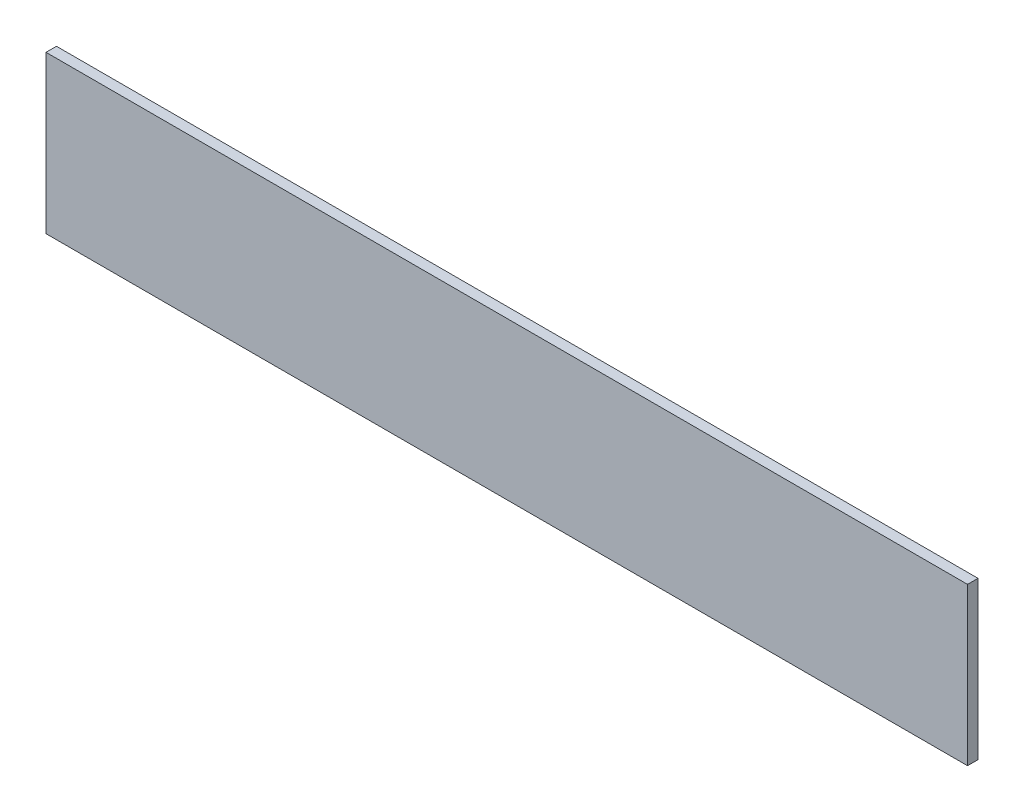
ISO-10303-21;
HEADER;
FILE_DESCRIPTION(('STEP AP214'),'2;1');
FILE_NAME('part.step','',(''),(''),'','','');
FILE_SCHEMA(('AUTOMOTIVE_DESIGN { 1 0 10303 214 1 1 1 1 }'));
ENDSEC;
DATA;
#1=APPLICATION_CONTEXT('core data for automotive mechanical design processes');
#2=APPLICATION_PROTOCOL_DEFINITION('international standard','automotive_design',2000,#1);
#3=PRODUCT_CONTEXT('',#1,'mechanical');
#4=PRODUCT('Part','Part','',(#3));
#5=PRODUCT_RELATED_PRODUCT_CATEGORY('part','',(#4));
#6=PRODUCT_DEFINITION_FORMATION('','',#4);
#7=PRODUCT_DEFINITION_CONTEXT('part definition',#1,'design');
#8=PRODUCT_DEFINITION('design','',#6,#7);
#9=PRODUCT_DEFINITION_SHAPE('','',#8);
#10=(LENGTH_UNIT() NAMED_UNIT(*) SI_UNIT(.MILLI.,.METRE.));
#11=(NAMED_UNIT(*) PLANE_ANGLE_UNIT() SI_UNIT($,.RADIAN.));
#12=(NAMED_UNIT(*) SI_UNIT($,.STERADIAN.) SOLID_ANGLE_UNIT());
#13=UNCERTAINTY_MEASURE_WITH_UNIT(LENGTH_MEASURE(1.E-05),#10,'distance_accuracy_value','');
#14=(GEOMETRIC_REPRESENTATION_CONTEXT(3) GLOBAL_UNCERTAINTY_ASSIGNED_CONTEXT((#13)) GLOBAL_UNIT_ASSIGNED_CONTEXT((#10,
#11,#12)) REPRESENTATION_CONTEXT('',''));
#15=CARTESIAN_POINT('',(0.,0.,0.));
#16=DIRECTION('',(0.,0.,1.));
#17=DIRECTION('',(1.,0.,0.));
#18=AXIS2_PLACEMENT_3D('',#15,#16,#17);
#19=CARTESIAN_POINT('',(44.,-7.5,1.));
#20=DIRECTION('',(-1.,0.,0.));
#21=DIRECTION('',(0.,0.,1.));
#22=AXIS2_PLACEMENT_3D('',#19,#20,#21);
#23=PLANE('',#22);
#24=DIRECTION('',(0.,1.,0.));
#25=VECTOR('',#24,1.);
#26=CARTESIAN_POINT('',(44.,-7.5,0.));
#27=LINE('',#26,#25);
#28=CARTESIAN_POINT('',(44.,-7.5,0.));
#29=VERTEX_POINT('',#28);
#30=CARTESIAN_POINT('',(44.,7.5,0.));
#31=VERTEX_POINT('',#30);
#32=EDGE_CURVE('E100',#29,#31,#27,.T.);
#33=ORIENTED_EDGE('',*,*,#32,.T.);
#34=DIRECTION('',(0.,0.,-1.));
#35=VECTOR('',#34,1.);
#36=CARTESIAN_POINT('',(44.,7.5,1.));
#37=LINE('',#36,#35);
#38=CARTESIAN_POINT('',(44.,7.5,1.));
#39=VERTEX_POINT('',#38);
#40=EDGE_CURVE('E11',#39,#31,#37,.T.);
#41=ORIENTED_EDGE('',*,*,#40,.F.);
#42=DIRECTION('',(0.,1.,0.));
#43=VECTOR('',#42,1.);
#44=CARTESIAN_POINT('',(44.,-7.5,1.));
#45=LINE('',#44,#43);
#46=CARTESIAN_POINT('',(44.,-7.5,1.));
#47=VERTEX_POINT('',#46);
#48=EDGE_CURVE('E88',#47,#39,#45,.T.);
#49=ORIENTED_EDGE('',*,*,#48,.F.);
#50=DIRECTION('',(0.,0.,-1.));
#51=VECTOR('',#50,1.);
#52=CARTESIAN_POINT('',(44.,-7.5,1.));
#53=LINE('',#52,#51);
#54=EDGE_CURVE('E96',#47,#29,#53,.T.);
#55=ORIENTED_EDGE('',*,*,#54,.T.);
#56=EDGE_LOOP('',(#33,#41,#49,#55));
#57=FACE_BOUND('',#56,.T.);
#58=ADVANCED_FACE('F37',(#57),#23,.F.);
#59=CARTESIAN_POINT('',(-44.,7.5,1.));
#60=DIRECTION('',(0.,-1.,0.));
#61=DIRECTION('',(0.,0.,-1.));
#62=AXIS2_PLACEMENT_3D('',#59,#60,#61);
#63=PLANE('',#62);
#64=DIRECTION('',(-1.,0.,0.));
#65=VECTOR('',#64,1.);
#66=CARTESIAN_POINT('',(-44.,7.5,0.));
#67=LINE('',#66,#65);
#68=CARTESIAN_POINT('',(-44.,7.5,0.));
#69=VERTEX_POINT('',#68);
#70=EDGE_CURVE('E92',#31,#69,#67,.T.);
#71=ORIENTED_EDGE('',*,*,#70,.T.);
#72=DIRECTION('',(0.,0.,-1.));
#73=VECTOR('',#72,1.);
#74=CARTESIAN_POINT('',(-44.,7.5,1.));
#75=LINE('',#74,#73);
#76=CARTESIAN_POINT('',(-44.,7.5,1.));
#77=VERTEX_POINT('',#76);
#78=EDGE_CURVE('E45',#77,#69,#75,.T.);
#79=ORIENTED_EDGE('',*,*,#78,.F.);
#80=DIRECTION('',(-1.,0.,0.));
#81=VECTOR('',#80,1.);
#82=CARTESIAN_POINT('',(-44.,7.5,1.));
#83=LINE('',#82,#81);
#84=EDGE_CURVE('E83',#39,#77,#83,.T.);
#85=ORIENTED_EDGE('',*,*,#84,.F.);
#86=ORIENTED_EDGE('',*,*,#40,.T.);
#87=EDGE_LOOP('',(#71,#79,#85,#86));
#88=FACE_BOUND('',#87,.T.);
#89=ADVANCED_FACE('F91',(#88),#63,.F.);
#90=CARTESIAN_POINT('',(-44.,-7.5,1.));
#91=DIRECTION('',(1.,0.,0.));
#92=DIRECTION('',(0.,0.,-1.));
#93=AXIS2_PLACEMENT_3D('',#90,#91,#92);
#94=PLANE('',#93);
#95=DIRECTION('',(0.,-1.,0.));
#96=VECTOR('',#95,1.);
#97=CARTESIAN_POINT('',(-44.,-7.5,0.));
#98=LINE('',#97,#96);
#99=CARTESIAN_POINT('',(-44.,-7.5,0.));
#100=VERTEX_POINT('',#99);
#101=EDGE_CURVE('E70',#69,#100,#98,.T.);
#102=ORIENTED_EDGE('',*,*,#101,.T.);
#103=DIRECTION('',(0.,0.,-1.));
#104=VECTOR('',#103,1.);
#105=CARTESIAN_POINT('',(-44.,-7.5,1.));
#106=LINE('',#105,#104);
#107=CARTESIAN_POINT('',(-44.,-7.5,1.));
#108=VERTEX_POINT('',#107);
#109=EDGE_CURVE('E93',#108,#100,#106,.T.);
#110=ORIENTED_EDGE('',*,*,#109,.F.);
#111=DIRECTION('',(0.,-1.,0.));
#112=VECTOR('',#111,1.);
#113=CARTESIAN_POINT('',(-44.,-7.5,1.));
#114=LINE('',#113,#112);
#115=EDGE_CURVE('E86',#77,#108,#114,.T.);
#116=ORIENTED_EDGE('',*,*,#115,.F.);
#117=ORIENTED_EDGE('',*,*,#78,.T.);
#118=EDGE_LOOP('',(#102,#110,#116,#117));
#119=FACE_BOUND('',#118,.T.);
#120=ADVANCED_FACE('F94',(#119),#94,.F.);
#121=CARTESIAN_POINT('',(-44.,-7.5,1.));
#122=DIRECTION('',(0.,1.,0.));
#123=DIRECTION('',(0.,0.,1.));
#124=AXIS2_PLACEMENT_3D('',#121,#122,#123);
#125=PLANE('',#124);
#126=DIRECTION('',(1.,0.,0.));
#127=VECTOR('',#126,1.);
#128=CARTESIAN_POINT('',(-44.,-7.5,0.));
#129=LINE('',#128,#127);
#130=EDGE_CURVE('E76',#100,#29,#129,.T.);
#131=ORIENTED_EDGE('',*,*,#130,.T.);
#132=ORIENTED_EDGE('',*,*,#54,.F.);
#133=DIRECTION('',(1.,0.,0.));
#134=VECTOR('',#133,1.);
#135=CARTESIAN_POINT('',(-44.,-7.5,1.));
#136=LINE('',#135,#134);
#137=EDGE_CURVE('E53',#108,#47,#136,.T.);
#138=ORIENTED_EDGE('',*,*,#137,.F.);
#139=ORIENTED_EDGE('',*,*,#109,.T.);
#140=EDGE_LOOP('',(#131,#132,#138,#139));
#141=FACE_BOUND('',#140,.T.);
#142=ADVANCED_FACE('F107',(#141),#125,.F.);
#143=CARTESIAN_POINT('',(0.,0.,1.));
#144=DIRECTION('',(0.,0.,-1.));
#145=DIRECTION('',(-1.,0.,0.));
#146=AXIS2_PLACEMENT_3D('',#143,#144,#145);
#147=PLANE('',#146);
#148=ORIENTED_EDGE('',*,*,#48,.T.);
#149=ORIENTED_EDGE('',*,*,#84,.T.);
#150=ORIENTED_EDGE('',*,*,#115,.T.);
#151=ORIENTED_EDGE('',*,*,#137,.T.);
#152=EDGE_LOOP('',(#148,#149,#150,#151));
#153=FACE_BOUND('',#152,.T.);
#154=ADVANCED_FACE('F84',(#153),#147,.F.);
#155=CARTESIAN_POINT('',(0.,0.,0.));
#156=DIRECTION('',(0.,0.,-1.));
#157=DIRECTION('',(-1.,0.,0.));
#158=AXIS2_PLACEMENT_3D('',#155,#156,#157);
#159=PLANE('',#158);
#160=ORIENTED_EDGE('',*,*,#32,.F.);
#161=ORIENTED_EDGE('',*,*,#130,.F.);
#162=ORIENTED_EDGE('',*,*,#101,.F.);
#163=ORIENTED_EDGE('',*,*,#70,.F.);
#164=EDGE_LOOP('',(#160,#161,#162,#163));
#165=FACE_BOUND('',#164,.T.);
#166=ADVANCED_FACE('F110',(#165),#159,.T.);
#167=CLOSED_SHELL('',(#58,#89,#120,#142,#154,#166));
#168=MANIFOLD_SOLID_BREP('B2',#167);
#169=ADVANCED_BREP_SHAPE_REPRESENTATION('',(#18,#168),#14);
#170=SHAPE_DEFINITION_REPRESENTATION(#9,#169);
ENDSEC;
END-ISO-10303-21;
